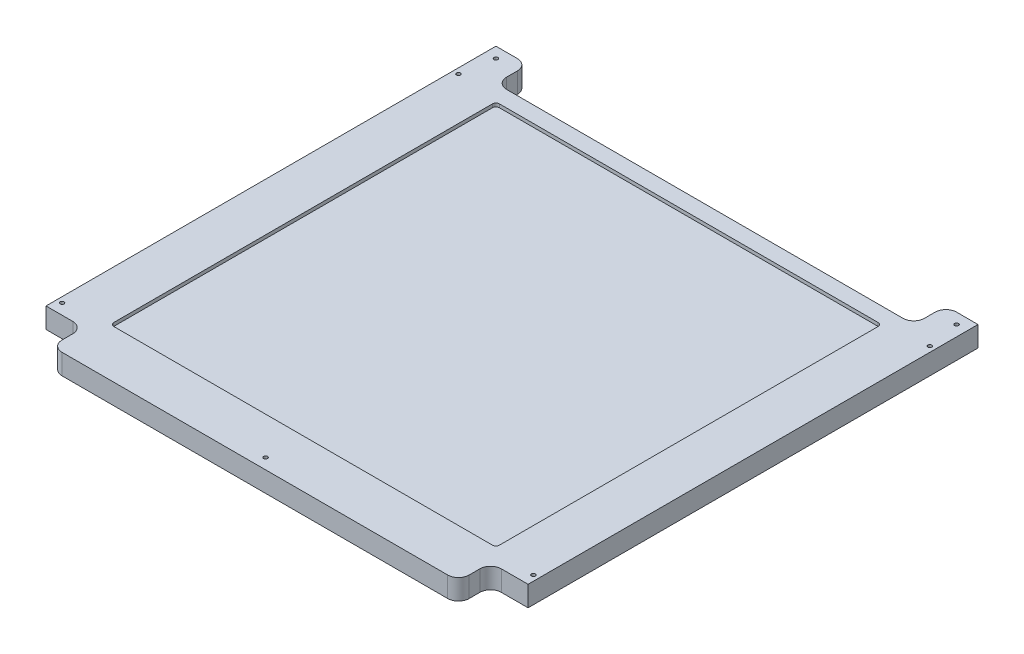
ISO-10303-21;
HEADER;
FILE_DESCRIPTION(('STEP AP214'),'2;1');
FILE_NAME('part.step','',(''),(''),'','','');
FILE_SCHEMA(('AUTOMOTIVE_DESIGN { 1 0 10303 214 1 1 1 1 }'));
ENDSEC;
DATA;
#1=APPLICATION_CONTEXT('core data for automotive mechanical design processes');
#2=APPLICATION_PROTOCOL_DEFINITION('international standard','automotive_design',2000,#1);
#3=PRODUCT_CONTEXT('',#1,'mechanical');
#4=PRODUCT('Part','Part','',(#3));
#5=PRODUCT_RELATED_PRODUCT_CATEGORY('part','',(#4));
#6=PRODUCT_DEFINITION_FORMATION('','',#4);
#7=PRODUCT_DEFINITION_CONTEXT('part definition',#1,'design');
#8=PRODUCT_DEFINITION('design','',#6,#7);
#9=PRODUCT_DEFINITION_SHAPE('','',#8);
#10=(LENGTH_UNIT() NAMED_UNIT(*) SI_UNIT(.MILLI.,.METRE.));
#11=(NAMED_UNIT(*) PLANE_ANGLE_UNIT() SI_UNIT($,.RADIAN.));
#12=(NAMED_UNIT(*) SI_UNIT($,.STERADIAN.) SOLID_ANGLE_UNIT());
#13=UNCERTAINTY_MEASURE_WITH_UNIT(LENGTH_MEASURE(1.E-05),#10,'distance_accuracy_value','');
#14=(GEOMETRIC_REPRESENTATION_CONTEXT(3) GLOBAL_UNCERTAINTY_ASSIGNED_CONTEXT((#13)) GLOBAL_UNIT_ASSIGNED_CONTEXT((#10,
#11,#12)) REPRESENTATION_CONTEXT('',''));
#15=CARTESIAN_POINT('',(0.,0.,0.));
#16=DIRECTION('',(0.,0.,1.));
#17=DIRECTION('',(1.,0.,0.));
#18=AXIS2_PLACEMENT_3D('',#15,#16,#17);
#19=CARTESIAN_POINT('',(0.,19.05,0.));
#20=DIRECTION('',(0.,-1.,0.));
#21=DIRECTION('',(0.,0.,-1.));
#22=AXIS2_PLACEMENT_3D('',#19,#20,#21);
#23=PLANE('',#22);
#24=CARTESIAN_POINT('',(445.,19.05,-410.));
#25=DIRECTION('',(0.,1.,0.));
#26=DIRECTION('',(0.,0.,1.));
#27=AXIS2_PLACEMENT_3D('',#24,#25,#26);
#28=CIRCLE('',#27,1.79999999999997);
#29=CARTESIAN_POINT('',(445.,19.05,-408.2));
#30=VERTEX_POINT('',#29);
#31=EDGE_CURVE('E862',#30,#30,#28,.T.);
#32=ORIENTED_EDGE('',*,*,#31,.F.);
#33=EDGE_LOOP('',(#32));
#34=FACE_BOUND('',#33,.T.);
#35=CARTESIAN_POINT('',(5.,19.05,-410.));
#36=DIRECTION('',(0.,1.,0.));
#37=DIRECTION('',(0.,0.,1.));
#38=AXIS2_PLACEMENT_3D('',#35,#36,#37);
#39=CIRCLE('',#38,1.79999999999999);
#40=CARTESIAN_POINT('',(5.,19.05,-408.2));
#41=VERTEX_POINT('',#40);
#42=EDGE_CURVE('E864',#41,#41,#39,.T.);
#43=ORIENTED_EDGE('',*,*,#42,.F.);
#44=EDGE_LOOP('',(#43));
#45=FACE_BOUND('',#44,.T.);
#46=CARTESIAN_POINT('',(5.,19.05,-40.));
#47=DIRECTION('',(0.,1.,0.));
#48=DIRECTION('',(0.,0.,1.));
#49=AXIS2_PLACEMENT_3D('',#46,#47,#48);
#50=CIRCLE('',#49,1.79999999999999);
#51=CARTESIAN_POINT('',(5.,19.05,-38.2));
#52=VERTEX_POINT('',#51);
#53=EDGE_CURVE('E872',#52,#52,#50,.T.);
#54=ORIENTED_EDGE('',*,*,#53,.F.);
#55=EDGE_LOOP('',(#54));
#56=FACE_BOUND('',#55,.T.);
#57=CARTESIAN_POINT('',(225.,19.05,-10.));
#58=DIRECTION('',(0.,1.,0.));
#59=DIRECTION('',(0.,0.,1.));
#60=AXIS2_PLACEMENT_3D('',#57,#58,#59);
#61=CIRCLE('',#60,1.8);
#62=CARTESIAN_POINT('',(225.,19.05,-8.2));
#63=VERTEX_POINT('',#62);
#64=EDGE_CURVE('E895',#63,#63,#61,.T.);
#65=ORIENTED_EDGE('',*,*,#64,.F.);
#66=EDGE_LOOP('',(#65));
#67=FACE_BOUND('',#66,.T.);
#68=DIRECTION('',(0.,0.,1.));
#69=VECTOR('',#68,1.);
#70=CARTESIAN_POINT('',(45.,19.05,-45.));
#71=LINE('',#70,#69);
#72=CARTESIAN_POINT('',(45.,19.05,-401.825));
#73=VERTEX_POINT('',#72);
#74=CARTESIAN_POINT('',(45.,19.05,-48.175));
#75=VERTEX_POINT('',#74);
#76=EDGE_CURVE('E401',#73,#75,#71,.T.);
#77=ORIENTED_EDGE('',*,*,#76,.F.);
#78=CARTESIAN_POINT('',(48.175,19.05,-401.825));
#79=DIRECTION('',(0.,-1.,0.));
#80=DIRECTION('',(0.,0.,-1.));
#81=AXIS2_PLACEMENT_3D('',#78,#79,#80);
#82=CIRCLE('',#81,3.175);
#83=CARTESIAN_POINT('',(48.175,19.05,-405.));
#84=VERTEX_POINT('',#83);
#85=EDGE_CURVE('E11',#73,#84,#82,.T.);
#86=ORIENTED_EDGE('',*,*,#85,.T.);
#87=DIRECTION('',(-1.,0.,0.));
#88=VECTOR('',#87,1.);
#89=CARTESIAN_POINT('',(45.,19.05,-405.));
#90=LINE('',#89,#88);
#91=CARTESIAN_POINT('',(401.825,19.05,-405.));
#92=VERTEX_POINT('',#91);
#93=EDGE_CURVE('E367',#92,#84,#90,.T.);
#94=ORIENTED_EDGE('',*,*,#93,.F.);
#95=CARTESIAN_POINT('',(401.825,19.05,-401.825));
#96=DIRECTION('',(0.,-1.,0.));
#97=DIRECTION('',(0.,0.,-1.));
#98=AXIS2_PLACEMENT_3D('',#95,#96,#97);
#99=CIRCLE('',#98,3.175);
#100=CARTESIAN_POINT('',(405.,19.05,-401.825));
#101=VERTEX_POINT('',#100);
#102=EDGE_CURVE('E43',#92,#101,#99,.T.);
#103=ORIENTED_EDGE('',*,*,#102,.T.);
#104=DIRECTION('',(0.,0.,-1.));
#105=VECTOR('',#104,1.);
#106=CARTESIAN_POINT('',(405.,19.05,-45.));
#107=LINE('',#106,#105);
#108=CARTESIAN_POINT('',(405.,19.05,-48.175));
#109=VERTEX_POINT('',#108);
#110=EDGE_CURVE('E366',#109,#101,#107,.T.);
#111=ORIENTED_EDGE('',*,*,#110,.F.);
#112=CARTESIAN_POINT('',(401.825,19.05,-48.175));
#113=DIRECTION('',(0.,-1.,0.));
#114=DIRECTION('',(0.,0.,-1.));
#115=AXIS2_PLACEMENT_3D('',#112,#113,#114);
#116=CIRCLE('',#115,3.175);
#117=CARTESIAN_POINT('',(401.825,19.05,-45.));
#118=VERTEX_POINT('',#117);
#119=EDGE_CURVE('E362',#109,#118,#116,.T.);
#120=ORIENTED_EDGE('',*,*,#119,.T.);
#121=DIRECTION('',(1.,0.,0.));
#122=VECTOR('',#121,1.);
#123=CARTESIAN_POINT('',(45.,19.05,-45.));
#124=LINE('',#123,#122);
#125=CARTESIAN_POINT('',(48.175,19.05,-45.));
#126=VERTEX_POINT('',#125);
#127=EDGE_CURVE('E374',#126,#118,#124,.T.);
#128=ORIENTED_EDGE('',*,*,#127,.F.);
#129=CARTESIAN_POINT('',(48.175,19.05,-48.175));
#130=DIRECTION('',(0.,-1.,0.));
#131=DIRECTION('',(0.,0.,-1.));
#132=AXIS2_PLACEMENT_3D('',#129,#130,#131);
#133=CIRCLE('',#132,3.175);
#134=EDGE_CURVE('E360',#126,#75,#133,.T.);
#135=ORIENTED_EDGE('',*,*,#134,.T.);
#136=EDGE_LOOP('',(#77,#86,#94,#103,#111,#120,#128,#135));
#137=FACE_BOUND('',#136,.T.);
#138=DIRECTION('',(-1.,0.,0.));
#139=VECTOR('',#138,1.);
#140=CARTESIAN_POINT('',(0.,19.05,-450.));
#141=LINE('',#140,#139);
#142=CARTESIAN_POINT('',(450.,19.05,-450.));
#143=VERTEX_POINT('',#142);
#144=CARTESIAN_POINT('',(430.,19.05,-450.));
#145=VERTEX_POINT('',#144);
#146=EDGE_CURVE('E260',#143,#145,#141,.T.);
#147=ORIENTED_EDGE('',*,*,#146,.T.);
#148=CARTESIAN_POINT('',(430.,19.05,-440.));
#149=DIRECTION('',(0.,-1.,0.));
#150=DIRECTION('',(0.,0.,-1.));
#151=AXIS2_PLACEMENT_3D('',#148,#149,#150);
#152=CIRCLE('',#151,10.);
#153=CARTESIAN_POINT('',(420.,19.05,-440.));
#154=VERTEX_POINT('',#153);
#155=EDGE_CURVE('E271',#145,#154,#152,.F.);
#156=ORIENTED_EDGE('',*,*,#155,.T.);
#157=DIRECTION('',(0.,0.,-1.));
#158=VECTOR('',#157,1.);
#159=CARTESIAN_POINT('',(420.,19.05,-450.));
#160=LINE('',#159,#158);
#161=CARTESIAN_POINT('',(420.,19.05,-430.));
#162=VERTEX_POINT('',#161);
#163=EDGE_CURVE('E415',#162,#154,#160,.T.);
#164=ORIENTED_EDGE('',*,*,#163,.F.);
#165=CARTESIAN_POINT('',(410.,19.05,-430.));
#166=DIRECTION('',(0.,-1.,0.));
#167=DIRECTION('',(0.,0.,-1.));
#168=AXIS2_PLACEMENT_3D('',#165,#166,#167);
#169=CIRCLE('',#168,10.);
#170=CARTESIAN_POINT('',(410.,19.05,-420.));
#171=VERTEX_POINT('',#170);
#172=EDGE_CURVE('E317',#162,#171,#169,.T.);
#173=ORIENTED_EDGE('',*,*,#172,.T.);
#174=DIRECTION('',(1.,0.,0.));
#175=VECTOR('',#174,1.);
#176=CARTESIAN_POINT('',(30.,19.05,-420.));
#177=LINE('',#176,#175);
#178=CARTESIAN_POINT('',(40.,19.05,-420.));
#179=VERTEX_POINT('',#178);
#180=EDGE_CURVE('E423',#179,#171,#177,.T.);
#181=ORIENTED_EDGE('',*,*,#180,.F.);
#182=CARTESIAN_POINT('',(40.,19.05,-430.));
#183=DIRECTION('',(0.,-1.,0.));
#184=DIRECTION('',(0.,0.,-1.));
#185=AXIS2_PLACEMENT_3D('',#182,#183,#184);
#186=CIRCLE('',#185,10.);
#187=CARTESIAN_POINT('',(30.,19.05,-430.));
#188=VERTEX_POINT('',#187);
#189=EDGE_CURVE('E321',#179,#188,#186,.T.);
#190=ORIENTED_EDGE('',*,*,#189,.T.);
#191=DIRECTION('',(0.,0.,1.));
#192=VECTOR('',#191,1.);
#193=CARTESIAN_POINT('',(30.,19.05,-450.));
#194=LINE('',#193,#192);
#195=CARTESIAN_POINT('',(30.,19.05,-440.));
#196=VERTEX_POINT('',#195);
#197=EDGE_CURVE('E239',#196,#188,#194,.T.);
#198=ORIENTED_EDGE('',*,*,#197,.F.);
#199=CARTESIAN_POINT('',(20.,19.05,-440.));
#200=DIRECTION('',(0.,-1.,0.));
#201=DIRECTION('',(0.,0.,-1.));
#202=AXIS2_PLACEMENT_3D('',#199,#200,#201);
#203=CIRCLE('',#202,10.);
#204=CARTESIAN_POINT('',(20.,19.05,-450.));
#205=VERTEX_POINT('',#204);
#206=EDGE_CURVE('E269',#196,#205,#203,.F.);
#207=ORIENTED_EDGE('',*,*,#206,.T.);
#208=CARTESIAN_POINT('',(0.,19.05,-450.));
#209=VERTEX_POINT('',#208);
#210=EDGE_CURVE('E446',#205,#209,#141,.T.);
#211=ORIENTED_EDGE('',*,*,#210,.T.);
#212=DIRECTION('',(0.,0.,1.));
#213=VECTOR('',#212,1.);
#214=CARTESIAN_POINT('',(0.,19.05,0.));
#215=LINE('',#214,#213);
#216=CARTESIAN_POINT('',(0.,19.05,-30.));
#217=VERTEX_POINT('',#216);
#218=EDGE_CURVE('E255',#209,#217,#215,.T.);
#219=ORIENTED_EDGE('',*,*,#218,.T.);
#220=DIRECTION('',(-1.,0.,0.));
#221=VECTOR('',#220,1.);
#222=CARTESIAN_POINT('',(0.,19.05,-30.));
#223=LINE('',#222,#221);
#224=CARTESIAN_POINT('',(25.,19.05,-30.));
#225=VERTEX_POINT('',#224);
#226=EDGE_CURVE('E432',#225,#217,#223,.T.);
#227=ORIENTED_EDGE('',*,*,#226,.F.);
#228=CARTESIAN_POINT('',(25.,19.05,-20.));
#229=DIRECTION('',(0.,-1.,0.));
#230=DIRECTION('',(0.,0.,-1.));
#231=AXIS2_PLACEMENT_3D('',#228,#229,#230);
#232=CIRCLE('',#231,10.);
#233=CARTESIAN_POINT('',(35.,19.05,-20.));
#234=VERTEX_POINT('',#233);
#235=EDGE_CURVE('E329',#225,#234,#232,.T.);
#236=ORIENTED_EDGE('',*,*,#235,.T.);
#237=DIRECTION('',(0.,0.,-1.));
#238=VECTOR('',#237,1.);
#239=CARTESIAN_POINT('',(35.,19.05,0.));
#240=LINE('',#239,#238);
#241=CARTESIAN_POINT('',(35.,19.05,-10.));
#242=VERTEX_POINT('',#241);
#243=EDGE_CURVE('E420',#242,#234,#240,.T.);
#244=ORIENTED_EDGE('',*,*,#243,.F.);
#245=CARTESIAN_POINT('',(45.,19.05,-10.));
#246=DIRECTION('',(0.,-1.,0.));
#247=DIRECTION('',(0.,0.,-1.));
#248=AXIS2_PLACEMENT_3D('',#245,#246,#247);
#249=CIRCLE('',#248,10.);
#250=CARTESIAN_POINT('',(45.,19.05,0.));
#251=VERTEX_POINT('',#250);
#252=EDGE_CURVE('E265',#242,#251,#249,.F.);
#253=ORIENTED_EDGE('',*,*,#252,.T.);
#254=DIRECTION('',(1.,0.,0.));
#255=VECTOR('',#254,1.);
#256=CARTESIAN_POINT('',(0.,19.05,0.));
#257=LINE('',#256,#255);
#258=CARTESIAN_POINT('',(405.,19.05,0.));
#259=VERTEX_POINT('',#258);
#260=EDGE_CURVE('E442',#251,#259,#257,.T.);
#261=ORIENTED_EDGE('',*,*,#260,.T.);
#262=CARTESIAN_POINT('',(405.,19.05,-10.));
#263=DIRECTION('',(0.,-1.,0.));
#264=DIRECTION('',(0.,0.,-1.));
#265=AXIS2_PLACEMENT_3D('',#262,#263,#264);
#266=CIRCLE('',#265,10.);
#267=CARTESIAN_POINT('',(415.,19.05,-10.));
#268=VERTEX_POINT('',#267);
#269=EDGE_CURVE('E267',#259,#268,#266,.F.);
#270=ORIENTED_EDGE('',*,*,#269,.T.);
#271=DIRECTION('',(0.,0.,1.));
#272=VECTOR('',#271,1.);
#273=CARTESIAN_POINT('',(415.,19.05,0.));
#274=LINE('',#273,#272);
#275=CARTESIAN_POINT('',(415.,19.05,-20.));
#276=VERTEX_POINT('',#275);
#277=EDGE_CURVE('E230',#276,#268,#274,.T.);
#278=ORIENTED_EDGE('',*,*,#277,.F.);
#279=CARTESIAN_POINT('',(425.,19.05,-20.));
#280=DIRECTION('',(0.,-1.,0.));
#281=DIRECTION('',(0.,0.,-1.));
#282=AXIS2_PLACEMENT_3D('',#279,#280,#281);
#283=CIRCLE('',#282,10.);
#284=CARTESIAN_POINT('',(425.,19.05,-30.));
#285=VERTEX_POINT('',#284);
#286=EDGE_CURVE('E325',#276,#285,#283,.T.);
#287=ORIENTED_EDGE('',*,*,#286,.T.);
#288=DIRECTION('',(-1.,0.,0.));
#289=VECTOR('',#288,1.);
#290=CARTESIAN_POINT('',(450.,19.05,-30.));
#291=LINE('',#290,#289);
#292=CARTESIAN_POINT('',(450.,19.05,-30.));
#293=VERTEX_POINT('',#292);
#294=EDGE_CURVE('E399',#293,#285,#291,.T.);
#295=ORIENTED_EDGE('',*,*,#294,.F.);
#296=DIRECTION('',(0.,0.,-1.));
#297=VECTOR('',#296,1.);
#298=CARTESIAN_POINT('',(450.,19.05,0.));
#299=LINE('',#298,#297);
#300=EDGE_CURVE('E238',#293,#143,#299,.T.);
#301=ORIENTED_EDGE('',*,*,#300,.T.);
#302=EDGE_LOOP('',(#147,#156,#164,#173,#181,#190,#198,#207,#211,#219,#227,#236,#244,#253,#261,
#270,#278,#287,#295,#301));
#303=FACE_BOUND('',#302,.T.);
#304=CARTESIAN_POINT('',(10.,19.05,-440.));
#305=DIRECTION('',(0.,1.,0.));
#306=DIRECTION('',(0.,0.,1.));
#307=AXIS2_PLACEMENT_3D('',#304,#305,#306);
#308=CIRCLE('',#307,1.79999999999999);
#309=CARTESIAN_POINT('',(10.,19.05,-438.2));
#310=VERTEX_POINT('',#309);
#311=EDGE_CURVE('E890',#310,#310,#308,.T.);
#312=ORIENTED_EDGE('',*,*,#311,.F.);
#313=EDGE_LOOP('',(#312));
#314=FACE_BOUND('',#313,.T.);
#315=CARTESIAN_POINT('',(440.,19.05,-440.));
#316=DIRECTION('',(0.,1.,0.));
#317=DIRECTION('',(0.,0.,1.));
#318=AXIS2_PLACEMENT_3D('',#315,#316,#317);
#319=CIRCLE('',#318,1.79999999999997);
#320=CARTESIAN_POINT('',(440.,19.05,-438.2));
#321=VERTEX_POINT('',#320);
#322=EDGE_CURVE('E884',#321,#321,#319,.T.);
#323=ORIENTED_EDGE('',*,*,#322,.F.);
#324=EDGE_LOOP('',(#323));
#325=FACE_BOUND('',#324,.T.);
#326=CARTESIAN_POINT('',(445.,19.05,-40.));
#327=DIRECTION('',(0.,1.,0.));
#328=DIRECTION('',(0.,0.,1.));
#329=AXIS2_PLACEMENT_3D('',#326,#327,#328);
#330=CIRCLE('',#329,1.79999999999997);
#331=CARTESIAN_POINT('',(445.,19.05,-38.2));
#332=VERTEX_POINT('',#331);
#333=EDGE_CURVE('E878',#332,#332,#330,.T.);
#334=ORIENTED_EDGE('',*,*,#333,.F.);
#335=EDGE_LOOP('',(#334));
#336=FACE_BOUND('',#335,.T.);
#337=ADVANCED_FACE('F35',(#34,#45,#56,#67,#137,#303,#314,#325,#336),#23,.F.);
#338=CARTESIAN_POINT('',(0.,19.05,-450.));
#339=DIRECTION('',(0.,0.,1.));
#340=DIRECTION('',(1.,0.,0.));
#341=AXIS2_PLACEMENT_3D('',#338,#339,#340);
#342=PLANE('',#341);
#343=ORIENTED_EDGE('',*,*,#210,.F.);
#344=DIRECTION('',(0.,1.,0.));
#345=VECTOR('',#344,1.);
#346=CARTESIAN_POINT('',(20.,19.05,-450.));
#347=LINE('',#346,#345);
#348=CARTESIAN_POINT('',(20.,0.,-450.));
#349=VERTEX_POINT('',#348);
#350=EDGE_CURVE('E296',#205,#349,#347,.F.);
#351=ORIENTED_EDGE('',*,*,#350,.T.);
#352=DIRECTION('',(-1.,0.,0.));
#353=VECTOR('',#352,1.);
#354=CARTESIAN_POINT('',(0.,0.,-450.));
#355=LINE('',#354,#353);
#356=CARTESIAN_POINT('',(0.,0.,-450.));
#357=VERTEX_POINT('',#356);
#358=EDGE_CURVE('E246',#349,#357,#355,.T.);
#359=ORIENTED_EDGE('',*,*,#358,.T.);
#360=DIRECTION('',(0.,-1.,0.));
#361=VECTOR('',#360,1.);
#362=CARTESIAN_POINT('',(0.,19.05,-450.));
#363=LINE('',#362,#361);
#364=EDGE_CURVE('E256',#209,#357,#363,.T.);
#365=ORIENTED_EDGE('',*,*,#364,.F.);
#366=EDGE_LOOP('',(#343,#351,#359,#365));
#367=FACE_BOUND('',#366,.T.);
#368=ADVANCED_FACE('F469',(#367),#342,.F.);
#369=CARTESIAN_POINT('',(0.,19.05,0.));
#370=DIRECTION('',(1.,0.,0.));
#371=DIRECTION('',(0.,0.,-1.));
#372=AXIS2_PLACEMENT_3D('',#369,#370,#371);
#373=PLANE('',#372);
#374=DIRECTION('',(0.,0.,1.));
#375=VECTOR('',#374,1.);
#376=CARTESIAN_POINT('',(0.,0.,0.));
#377=LINE('',#376,#375);
#378=CARTESIAN_POINT('',(0.,0.,-30.));
#379=VERTEX_POINT('',#378);
#380=EDGE_CURVE('E251',#357,#379,#377,.T.);
#381=ORIENTED_EDGE('',*,*,#380,.T.);
#382=DIRECTION('',(0.,1.,0.));
#383=VECTOR('',#382,1.);
#384=CARTESIAN_POINT('',(0.,0.,-30.));
#385=LINE('',#384,#383);
#386=EDGE_CURVE('E434',#379,#217,#385,.T.);
#387=ORIENTED_EDGE('',*,*,#386,.T.);
#388=ORIENTED_EDGE('',*,*,#218,.F.);
#389=ORIENTED_EDGE('',*,*,#364,.T.);
#390=EDGE_LOOP('',(#381,#387,#388,#389));
#391=FACE_BOUND('',#390,.T.);
#392=ADVANCED_FACE('F451',(#391),#373,.F.);
#393=CARTESIAN_POINT('',(0.,19.05,0.));
#394=DIRECTION('',(0.,0.,-1.));
#395=DIRECTION('',(-1.,0.,0.));
#396=AXIS2_PLACEMENT_3D('',#393,#394,#395);
#397=PLANE('',#396);
#398=DIRECTION('',(1.,0.,0.));
#399=VECTOR('',#398,1.);
#400=CARTESIAN_POINT('',(0.,0.,0.));
#401=LINE('',#400,#399);
#402=CARTESIAN_POINT('',(45.,0.,0.));
#403=VERTEX_POINT('',#402);
#404=CARTESIAN_POINT('',(405.,0.,0.));
#405=VERTEX_POINT('',#404);
#406=EDGE_CURVE('E247',#403,#405,#401,.T.);
#407=ORIENTED_EDGE('',*,*,#406,.T.);
#408=DIRECTION('',(0.,1.,0.));
#409=VECTOR('',#408,1.);
#410=CARTESIAN_POINT('',(405.,19.05,0.));
#411=LINE('',#410,#409);
#412=EDGE_CURVE('E306',#405,#259,#411,.T.);
#413=ORIENTED_EDGE('',*,*,#412,.T.);
#414=ORIENTED_EDGE('',*,*,#260,.F.);
#415=DIRECTION('',(0.,1.,0.));
#416=VECTOR('',#415,1.);
#417=CARTESIAN_POINT('',(45.,19.05,0.));
#418=LINE('',#417,#416);
#419=EDGE_CURVE('E304',#251,#403,#418,.F.);
#420=ORIENTED_EDGE('',*,*,#419,.T.);
#421=EDGE_LOOP('',(#407,#413,#414,#420));
#422=FACE_BOUND('',#421,.T.);
#423=ADVANCED_FACE('F517',(#422),#397,.F.);
#424=CARTESIAN_POINT('',(450.,19.05,0.));
#425=DIRECTION('',(-1.,0.,0.));
#426=DIRECTION('',(0.,0.,1.));
#427=AXIS2_PLACEMENT_3D('',#424,#425,#426);
#428=PLANE('',#427);
#429=ORIENTED_EDGE('',*,*,#300,.F.);
#430=DIRECTION('',(0.,1.,0.));
#431=VECTOR('',#430,1.);
#432=CARTESIAN_POINT('',(450.,0.,-30.));
#433=LINE('',#432,#431);
#434=CARTESIAN_POINT('',(450.,0.,-30.));
#435=VERTEX_POINT('',#434);
#436=EDGE_CURVE('E222',#435,#293,#433,.T.);
#437=ORIENTED_EDGE('',*,*,#436,.F.);
#438=DIRECTION('',(0.,0.,-1.));
#439=VECTOR('',#438,1.);
#440=CARTESIAN_POINT('',(450.,0.,0.));
#441=LINE('',#440,#439);
#442=CARTESIAN_POINT('',(450.,0.,-450.));
#443=VERTEX_POINT('',#442);
#444=EDGE_CURVE('E236',#435,#443,#441,.T.);
#445=ORIENTED_EDGE('',*,*,#444,.T.);
#446=DIRECTION('',(0.,-1.,0.));
#447=VECTOR('',#446,1.);
#448=CARTESIAN_POINT('',(450.,19.05,-450.));
#449=LINE('',#448,#447);
#450=EDGE_CURVE('E259',#143,#443,#449,.T.);
#451=ORIENTED_EDGE('',*,*,#450,.F.);
#452=EDGE_LOOP('',(#429,#437,#445,#451));
#453=FACE_BOUND('',#452,.T.);
#454=ADVANCED_FACE('F234',(#453),#428,.F.);
#455=CARTESIAN_POINT('',(430.,0.,-450.));
#456=VERTEX_POINT('',#455);
#457=EDGE_CURVE('E245',#443,#456,#355,.T.);
#458=ORIENTED_EDGE('',*,*,#457,.T.);
#459=DIRECTION('',(0.,1.,0.));
#460=VECTOR('',#459,1.);
#461=CARTESIAN_POINT('',(430.,19.05,-450.));
#462=LINE('',#461,#460);
#463=EDGE_CURVE('E262',#456,#145,#462,.T.);
#464=ORIENTED_EDGE('',*,*,#463,.T.);
#465=ORIENTED_EDGE('',*,*,#146,.F.);
#466=ORIENTED_EDGE('',*,*,#450,.T.);
#467=EDGE_LOOP('',(#458,#464,#465,#466));
#468=FACE_BOUND('',#467,.T.);
#469=ADVANCED_FACE('F500',(#468),#342,.F.);
#470=CARTESIAN_POINT('',(0.,0.,0.));
#471=DIRECTION('',(0.,-1.,0.));
#472=DIRECTION('',(0.,0.,-1.));
#473=AXIS2_PLACEMENT_3D('',#470,#471,#472);
#474=PLANE('',#473);
#475=CARTESIAN_POINT('',(445.,0.,-410.));
#476=DIRECTION('',(0.,1.,0.));
#477=DIRECTION('',(0.,0.,1.));
#478=AXIS2_PLACEMENT_3D('',#475,#476,#477);
#479=CIRCLE('',#478,1.80000000000002);
#480=CARTESIAN_POINT('',(445.,0.,-408.2));
#481=VERTEX_POINT('',#480);
#482=EDGE_CURVE('E860',#481,#481,#479,.T.);
#483=ORIENTED_EDGE('',*,*,#482,.T.);
#484=EDGE_LOOP('',(#483));
#485=FACE_BOUND('',#484,.T.);
#486=CARTESIAN_POINT('',(5.,0.,-410.));
#487=DIRECTION('',(0.,1.,0.));
#488=DIRECTION('',(0.,0.,1.));
#489=AXIS2_PLACEMENT_3D('',#486,#487,#488);
#490=CIRCLE('',#489,1.8);
#491=CARTESIAN_POINT('',(5.,0.,-408.2));
#492=VERTEX_POINT('',#491);
#493=EDGE_CURVE('E869',#492,#492,#490,.T.);
#494=ORIENTED_EDGE('',*,*,#493,.T.);
#495=EDGE_LOOP('',(#494));
#496=FACE_BOUND('',#495,.T.);
#497=CARTESIAN_POINT('',(5.,0.,-40.));
#498=DIRECTION('',(0.,1.,0.));
#499=DIRECTION('',(0.,0.,1.));
#500=AXIS2_PLACEMENT_3D('',#497,#498,#499);
#501=CIRCLE('',#500,1.8);
#502=CARTESIAN_POINT('',(5.,0.,-38.2));
#503=VERTEX_POINT('',#502);
#504=EDGE_CURVE('E875',#503,#503,#501,.T.);
#505=ORIENTED_EDGE('',*,*,#504,.T.);
#506=EDGE_LOOP('',(#505));
#507=FACE_BOUND('',#506,.T.);
#508=CARTESIAN_POINT('',(445.,0.,-40.));
#509=DIRECTION('',(0.,1.,0.));
#510=DIRECTION('',(0.,0.,1.));
#511=AXIS2_PLACEMENT_3D('',#508,#509,#510);
#512=CIRCLE('',#511,1.80000000000002);
#513=CARTESIAN_POINT('',(445.,0.,-38.2));
#514=VERTEX_POINT('',#513);
#515=EDGE_CURVE('E881',#514,#514,#512,.T.);
#516=ORIENTED_EDGE('',*,*,#515,.T.);
#517=EDGE_LOOP('',(#516));
#518=FACE_BOUND('',#517,.T.);
#519=CARTESIAN_POINT('',(440.,0.,-440.));
#520=DIRECTION('',(0.,1.,0.));
#521=DIRECTION('',(0.,0.,1.));
#522=AXIS2_PLACEMENT_3D('',#519,#520,#521);
#523=CIRCLE('',#522,1.80000000000002);
#524=CARTESIAN_POINT('',(440.,0.,-438.2));
#525=VERTEX_POINT('',#524);
#526=EDGE_CURVE('E887',#525,#525,#523,.T.);
#527=ORIENTED_EDGE('',*,*,#526,.T.);
#528=EDGE_LOOP('',(#527));
#529=FACE_BOUND('',#528,.T.);
#530=CARTESIAN_POINT('',(10.,0.,-440.));
#531=DIRECTION('',(0.,1.,0.));
#532=DIRECTION('',(0.,0.,1.));
#533=AXIS2_PLACEMENT_3D('',#530,#531,#532);
#534=CIRCLE('',#533,1.8);
#535=CARTESIAN_POINT('',(10.,0.,-438.2));
#536=VERTEX_POINT('',#535);
#537=EDGE_CURVE('E893',#536,#536,#534,.T.);
#538=ORIENTED_EDGE('',*,*,#537,.T.);
#539=EDGE_LOOP('',(#538));
#540=FACE_BOUND('',#539,.T.);
#541=CARTESIAN_POINT('',(225.,0.,-10.));
#542=DIRECTION('',(0.,1.,0.));
#543=DIRECTION('',(0.,0.,1.));
#544=AXIS2_PLACEMENT_3D('',#541,#542,#543);
#545=CIRCLE('',#544,1.8);
#546=CARTESIAN_POINT('',(225.,0.,-8.2));
#547=VERTEX_POINT('',#546);
#548=EDGE_CURVE('E393',#547,#547,#545,.T.);
#549=ORIENTED_EDGE('',*,*,#548,.T.);
#550=EDGE_LOOP('',(#549));
#551=FACE_BOUND('',#550,.T.);
#552=DIRECTION('',(0.,0.,-1.));
#553=VECTOR('',#552,1.);
#554=CARTESIAN_POINT('',(420.,0.,-450.));
#555=LINE('',#554,#553);
#556=CARTESIAN_POINT('',(420.,0.,-430.));
#557=VERTEX_POINT('',#556);
#558=CARTESIAN_POINT('',(420.,0.,-440.));
#559=VERTEX_POINT('',#558);
#560=EDGE_CURVE('E418',#557,#559,#555,.T.);
#561=ORIENTED_EDGE('',*,*,#560,.T.);
#562=CARTESIAN_POINT('',(430.,0.,-440.));
#563=DIRECTION('',(0.,-1.,0.));
#564=DIRECTION('',(0.,0.,-1.));
#565=AXIS2_PLACEMENT_3D('',#562,#563,#564);
#566=CIRCLE('',#565,10.);
#567=EDGE_CURVE('E284',#559,#456,#566,.T.);
#568=ORIENTED_EDGE('',*,*,#567,.T.);
#569=ORIENTED_EDGE('',*,*,#457,.F.);
#570=ORIENTED_EDGE('',*,*,#444,.F.);
#571=DIRECTION('',(-1.,0.,0.));
#572=VECTOR('',#571,1.);
#573=CARTESIAN_POINT('',(450.,0.,-30.));
#574=LINE('',#573,#572);
#575=CARTESIAN_POINT('',(425.,0.,-30.));
#576=VERTEX_POINT('',#575);
#577=EDGE_CURVE('E218',#435,#576,#574,.T.);
#578=ORIENTED_EDGE('',*,*,#577,.T.);
#579=CARTESIAN_POINT('',(425.,0.,-20.));
#580=DIRECTION('',(0.,-1.,0.));
#581=DIRECTION('',(0.,0.,-1.));
#582=AXIS2_PLACEMENT_3D('',#579,#580,#581);
#583=CIRCLE('',#582,10.);
#584=CARTESIAN_POINT('',(415.,0.,-20.));
#585=VERTEX_POINT('',#584);
#586=EDGE_CURVE('E327',#576,#585,#583,.F.);
#587=ORIENTED_EDGE('',*,*,#586,.T.);
#588=DIRECTION('',(0.,0.,1.));
#589=VECTOR('',#588,1.);
#590=CARTESIAN_POINT('',(415.,0.,0.));
#591=LINE('',#590,#589);
#592=CARTESIAN_POINT('',(415.,0.,-10.));
#593=VERTEX_POINT('',#592);
#594=EDGE_CURVE('E229',#585,#593,#591,.T.);
#595=ORIENTED_EDGE('',*,*,#594,.T.);
#596=CARTESIAN_POINT('',(405.,0.,-10.));
#597=DIRECTION('',(0.,-1.,0.));
#598=DIRECTION('',(0.,0.,-1.));
#599=AXIS2_PLACEMENT_3D('',#596,#597,#598);
#600=CIRCLE('',#599,10.);
#601=EDGE_CURVE('E280',#593,#405,#600,.T.);
#602=ORIENTED_EDGE('',*,*,#601,.T.);
#603=ORIENTED_EDGE('',*,*,#406,.F.);
#604=CARTESIAN_POINT('',(45.,0.,-10.));
#605=DIRECTION('',(0.,-1.,0.));
#606=DIRECTION('',(0.,0.,-1.));
#607=AXIS2_PLACEMENT_3D('',#604,#605,#606);
#608=CIRCLE('',#607,10.);
#609=CARTESIAN_POINT('',(35.,0.,-10.));
#610=VERTEX_POINT('',#609);
#611=EDGE_CURVE('E278',#403,#610,#608,.T.);
#612=ORIENTED_EDGE('',*,*,#611,.T.);
#613=DIRECTION('',(0.,0.,-1.));
#614=VECTOR('',#613,1.);
#615=CARTESIAN_POINT('',(35.,0.,0.));
#616=LINE('',#615,#614);
#617=CARTESIAN_POINT('',(35.,0.,-20.));
#618=VERTEX_POINT('',#617);
#619=EDGE_CURVE('E428',#610,#618,#616,.T.);
#620=ORIENTED_EDGE('',*,*,#619,.T.);
#621=CARTESIAN_POINT('',(25.,0.,-20.));
#622=DIRECTION('',(0.,-1.,0.));
#623=DIRECTION('',(0.,0.,-1.));
#624=AXIS2_PLACEMENT_3D('',#621,#622,#623);
#625=CIRCLE('',#624,10.);
#626=CARTESIAN_POINT('',(25.,0.,-30.));
#627=VERTEX_POINT('',#626);
#628=EDGE_CURVE('E331',#618,#627,#625,.F.);
#629=ORIENTED_EDGE('',*,*,#628,.T.);
#630=DIRECTION('',(-1.,0.,0.));
#631=VECTOR('',#630,1.);
#632=CARTESIAN_POINT('',(0.,0.,-30.));
#633=LINE('',#632,#631);
#634=EDGE_CURVE('E431',#627,#379,#633,.T.);
#635=ORIENTED_EDGE('',*,*,#634,.T.);
#636=ORIENTED_EDGE('',*,*,#380,.F.);
#637=ORIENTED_EDGE('',*,*,#358,.F.);
#638=CARTESIAN_POINT('',(20.,0.,-440.));
#639=DIRECTION('',(0.,-1.,0.));
#640=DIRECTION('',(0.,0.,-1.));
#641=AXIS2_PLACEMENT_3D('',#638,#639,#640);
#642=CIRCLE('',#641,10.);
#643=CARTESIAN_POINT('',(30.,0.,-440.));
#644=VERTEX_POINT('',#643);
#645=EDGE_CURVE('E282',#349,#644,#642,.T.);
#646=ORIENTED_EDGE('',*,*,#645,.T.);
#647=DIRECTION('',(0.,0.,1.));
#648=VECTOR('',#647,1.);
#649=CARTESIAN_POINT('',(30.,0.,-450.));
#650=LINE('',#649,#648);
#651=CARTESIAN_POINT('',(30.,0.,-430.));
#652=VERTEX_POINT('',#651);
#653=EDGE_CURVE('E411',#644,#652,#650,.T.);
#654=ORIENTED_EDGE('',*,*,#653,.T.);
#655=CARTESIAN_POINT('',(40.,0.,-430.));
#656=DIRECTION('',(0.,-1.,0.));
#657=DIRECTION('',(0.,0.,-1.));
#658=AXIS2_PLACEMENT_3D('',#655,#656,#657);
#659=CIRCLE('',#658,10.);
#660=CARTESIAN_POINT('',(40.,0.,-420.));
#661=VERTEX_POINT('',#660);
#662=EDGE_CURVE('E323',#652,#661,#659,.F.);
#663=ORIENTED_EDGE('',*,*,#662,.T.);
#664=DIRECTION('',(1.,0.,0.));
#665=VECTOR('',#664,1.);
#666=CARTESIAN_POINT('',(30.,0.,-420.));
#667=LINE('',#666,#665);
#668=CARTESIAN_POINT('',(410.,0.,-420.));
#669=VERTEX_POINT('',#668);
#670=EDGE_CURVE('E414',#661,#669,#667,.T.);
#671=ORIENTED_EDGE('',*,*,#670,.T.);
#672=CARTESIAN_POINT('',(410.,0.,-430.));
#673=DIRECTION('',(0.,-1.,0.));
#674=DIRECTION('',(0.,0.,-1.));
#675=AXIS2_PLACEMENT_3D('',#672,#673,#674);
#676=CIRCLE('',#675,10.);
#677=EDGE_CURVE('E319',#669,#557,#676,.F.);
#678=ORIENTED_EDGE('',*,*,#677,.T.);
#679=EDGE_LOOP('',(#561,#568,#569,#570,#578,#587,#595,#602,#603,#612,#620,#629,#635,#636,#637,
#646,#654,#663,#671,#678));
#680=FACE_BOUND('',#679,.T.);
#681=ADVANCED_FACE('F243',(#485,#496,#507,#518,#529,#540,#551,#680),#474,.T.);
#682=CARTESIAN_POINT('',(0.,0.,-30.));
#683=DIRECTION('',(0.,0.,-1.));
#684=DIRECTION('',(-1.,0.,0.));
#685=AXIS2_PLACEMENT_3D('',#682,#683,#684);
#686=PLANE('',#685);
#687=ORIENTED_EDGE('',*,*,#634,.F.);
#688=DIRECTION('',(0.,1.,0.));
#689=VECTOR('',#688,1.);
#690=CARTESIAN_POINT('',(25.,19.05,-30.));
#691=LINE('',#690,#689);
#692=EDGE_CURVE('E314',#627,#225,#691,.T.);
#693=ORIENTED_EDGE('',*,*,#692,.T.);
#694=ORIENTED_EDGE('',*,*,#226,.T.);
#695=ORIENTED_EDGE('',*,*,#386,.F.);
#696=EDGE_LOOP('',(#687,#693,#694,#695));
#697=FACE_BOUND('',#696,.T.);
#698=ADVANCED_FACE('F461',(#697),#686,.F.);
#699=CARTESIAN_POINT('',(35.,0.,0.));
#700=DIRECTION('',(1.,0.,0.));
#701=DIRECTION('',(0.,0.,-1.));
#702=AXIS2_PLACEMENT_3D('',#699,#700,#701);
#703=PLANE('',#702);
#704=ORIENTED_EDGE('',*,*,#619,.F.);
#705=DIRECTION('',(0.,1.,0.));
#706=VECTOR('',#705,1.);
#707=CARTESIAN_POINT('',(35.,0.,-10.));
#708=LINE('',#707,#706);
#709=EDGE_CURVE('E311',#610,#242,#708,.T.);
#710=ORIENTED_EDGE('',*,*,#709,.T.);
#711=ORIENTED_EDGE('',*,*,#243,.T.);
#712=DIRECTION('',(0.,1.,0.));
#713=VECTOR('',#712,1.);
#714=CARTESIAN_POINT('',(35.,0.,-20.));
#715=LINE('',#714,#713);
#716=EDGE_CURVE('E309',#234,#618,#715,.F.);
#717=ORIENTED_EDGE('',*,*,#716,.T.);
#718=EDGE_LOOP('',(#704,#710,#711,#717));
#719=FACE_BOUND('',#718,.T.);
#720=ADVANCED_FACE('F525',(#719),#703,.F.);
#721=CARTESIAN_POINT('',(30.,0.,-450.));
#722=DIRECTION('',(-1.,0.,0.));
#723=DIRECTION('',(0.,0.,1.));
#724=AXIS2_PLACEMENT_3D('',#721,#722,#723);
#725=PLANE('',#724);
#726=ORIENTED_EDGE('',*,*,#197,.T.);
#727=DIRECTION('',(0.,1.,0.));
#728=VECTOR('',#727,1.);
#729=CARTESIAN_POINT('',(30.,0.,-430.));
#730=LINE('',#729,#728);
#731=EDGE_CURVE('E294',#188,#652,#730,.F.);
#732=ORIENTED_EDGE('',*,*,#731,.T.);
#733=ORIENTED_EDGE('',*,*,#653,.F.);
#734=DIRECTION('',(0.,1.,0.));
#735=VECTOR('',#734,1.);
#736=CARTESIAN_POINT('',(30.,0.,-440.));
#737=LINE('',#736,#735);
#738=EDGE_CURVE('E291',#644,#196,#737,.T.);
#739=ORIENTED_EDGE('',*,*,#738,.T.);
#740=EDGE_LOOP('',(#726,#732,#733,#739));
#741=FACE_BOUND('',#740,.T.);
#742=ADVANCED_FACE('F476',(#741),#725,.F.);
#743=CARTESIAN_POINT('',(420.,0.,-450.));
#744=DIRECTION('',(1.,0.,0.));
#745=DIRECTION('',(0.,0.,-1.));
#746=AXIS2_PLACEMENT_3D('',#743,#744,#745);
#747=PLANE('',#746);
#748=ORIENTED_EDGE('',*,*,#163,.T.);
#749=DIRECTION('',(0.,1.,0.));
#750=VECTOR('',#749,1.);
#751=CARTESIAN_POINT('',(420.,0.,-440.));
#752=LINE('',#751,#750);
#753=EDGE_CURVE('E276',#154,#559,#752,.F.);
#754=ORIENTED_EDGE('',*,*,#753,.T.);
#755=ORIENTED_EDGE('',*,*,#560,.F.);
#756=DIRECTION('',(0.,1.,0.));
#757=VECTOR('',#756,1.);
#758=CARTESIAN_POINT('',(420.,19.05,-430.));
#759=LINE('',#758,#757);
#760=EDGE_CURVE('E273',#557,#162,#759,.T.);
#761=ORIENTED_EDGE('',*,*,#760,.T.);
#762=EDGE_LOOP('',(#748,#754,#755,#761));
#763=FACE_BOUND('',#762,.T.);
#764=ADVANCED_FACE('F493',(#763),#747,.F.);
#765=CARTESIAN_POINT('',(30.,0.,-420.));
#766=DIRECTION('',(0.,0.,1.));
#767=DIRECTION('',(1.,0.,0.));
#768=AXIS2_PLACEMENT_3D('',#765,#766,#767);
#769=PLANE('',#768);
#770=ORIENTED_EDGE('',*,*,#180,.T.);
#771=DIRECTION('',(0.,1.,0.));
#772=VECTOR('',#771,1.);
#773=CARTESIAN_POINT('',(410.,0.,-420.));
#774=LINE('',#773,#772);
#775=EDGE_CURVE('E289',#171,#669,#774,.F.);
#776=ORIENTED_EDGE('',*,*,#775,.T.);
#777=ORIENTED_EDGE('',*,*,#670,.F.);
#778=DIRECTION('',(0.,1.,0.));
#779=VECTOR('',#778,1.);
#780=CARTESIAN_POINT('',(40.,19.05,-420.));
#781=LINE('',#780,#779);
#782=EDGE_CURVE('E286',#661,#179,#781,.T.);
#783=ORIENTED_EDGE('',*,*,#782,.T.);
#784=EDGE_LOOP('',(#770,#776,#777,#783));
#785=FACE_BOUND('',#784,.T.);
#786=ADVANCED_FACE('F484',(#785),#769,.F.);
#787=CARTESIAN_POINT('',(415.,0.,0.));
#788=DIRECTION('',(-1.,0.,0.));
#789=DIRECTION('',(0.,0.,1.));
#790=AXIS2_PLACEMENT_3D('',#787,#788,#789);
#791=PLANE('',#790);
#792=ORIENTED_EDGE('',*,*,#594,.F.);
#793=DIRECTION('',(0.,1.,0.));
#794=VECTOR('',#793,1.);
#795=CARTESIAN_POINT('',(415.,19.05,-20.));
#796=LINE('',#795,#794);
#797=EDGE_CURVE('E300',#585,#276,#796,.T.);
#798=ORIENTED_EDGE('',*,*,#797,.T.);
#799=ORIENTED_EDGE('',*,*,#277,.T.);
#800=DIRECTION('',(0.,1.,0.));
#801=VECTOR('',#800,1.);
#802=CARTESIAN_POINT('',(415.,0.,-10.));
#803=LINE('',#802,#801);
#804=EDGE_CURVE('E298',#268,#593,#803,.F.);
#805=ORIENTED_EDGE('',*,*,#804,.T.);
#806=EDGE_LOOP('',(#792,#798,#799,#805));
#807=FACE_BOUND('',#806,.T.);
#808=ADVANCED_FACE('F509',(#807),#791,.F.);
#809=CARTESIAN_POINT('',(450.,0.,-30.));
#810=DIRECTION('',(0.,0.,-1.));
#811=DIRECTION('',(-1.,0.,0.));
#812=AXIS2_PLACEMENT_3D('',#809,#810,#811);
#813=PLANE('',#812);
#814=ORIENTED_EDGE('',*,*,#294,.T.);
#815=DIRECTION('',(0.,1.,0.));
#816=VECTOR('',#815,1.);
#817=CARTESIAN_POINT('',(425.,0.,-30.));
#818=LINE('',#817,#816);
#819=EDGE_CURVE('E225',#285,#576,#818,.F.);
#820=ORIENTED_EDGE('',*,*,#819,.T.);
#821=ORIENTED_EDGE('',*,*,#577,.F.);
#822=ORIENTED_EDGE('',*,*,#436,.T.);
#823=EDGE_LOOP('',(#814,#820,#821,#822));
#824=FACE_BOUND('',#823,.T.);
#825=ADVANCED_FACE('F221',(#824),#813,.F.);
#826=CARTESIAN_POINT('',(430.,19.05,-440.));
#827=DIRECTION('',(0.,1.,0.));
#828=DIRECTION('',(0.,0.,1.));
#829=AXIS2_PLACEMENT_3D('',#826,#827,#828);
#830=CYLINDRICAL_SURFACE('',#829,10.);
#831=ORIENTED_EDGE('',*,*,#567,.F.);
#832=ORIENTED_EDGE('',*,*,#753,.F.);
#833=ORIENTED_EDGE('',*,*,#155,.F.);
#834=ORIENTED_EDGE('',*,*,#463,.F.);
#835=EDGE_LOOP('',(#831,#832,#833,#834));
#836=FACE_BOUND('',#835,.T.);
#837=ADVANCED_FACE('F497',(#836),#830,.T.);
#838=CARTESIAN_POINT('',(410.,0.,-430.));
#839=DIRECTION('',(0.,-1.,0.));
#840=DIRECTION('',(0.,0.,-1.));
#841=AXIS2_PLACEMENT_3D('',#838,#839,#840);
#842=CYLINDRICAL_SURFACE('',#841,10.);
#843=ORIENTED_EDGE('',*,*,#677,.F.);
#844=ORIENTED_EDGE('',*,*,#775,.F.);
#845=ORIENTED_EDGE('',*,*,#172,.F.);
#846=ORIENTED_EDGE('',*,*,#760,.F.);
#847=EDGE_LOOP('',(#843,#844,#845,#846));
#848=FACE_BOUND('',#847,.T.);
#849=ADVANCED_FACE('F488',(#848),#842,.F.);
#850=CARTESIAN_POINT('',(40.,0.,-430.));
#851=DIRECTION('',(0.,-1.,0.));
#852=DIRECTION('',(0.,0.,-1.));
#853=AXIS2_PLACEMENT_3D('',#850,#851,#852);
#854=CYLINDRICAL_SURFACE('',#853,10.);
#855=ORIENTED_EDGE('',*,*,#662,.F.);
#856=ORIENTED_EDGE('',*,*,#731,.F.);
#857=ORIENTED_EDGE('',*,*,#189,.F.);
#858=ORIENTED_EDGE('',*,*,#782,.F.);
#859=EDGE_LOOP('',(#855,#856,#857,#858));
#860=FACE_BOUND('',#859,.T.);
#861=ADVANCED_FACE('F479',(#860),#854,.F.);
#862=CARTESIAN_POINT('',(20.,0.,-440.));
#863=DIRECTION('',(0.,1.,0.));
#864=DIRECTION('',(0.,0.,1.));
#865=AXIS2_PLACEMENT_3D('',#862,#863,#864);
#866=CYLINDRICAL_SURFACE('',#865,10.);
#867=ORIENTED_EDGE('',*,*,#645,.F.);
#868=ORIENTED_EDGE('',*,*,#350,.F.);
#869=ORIENTED_EDGE('',*,*,#206,.F.);
#870=ORIENTED_EDGE('',*,*,#738,.F.);
#871=EDGE_LOOP('',(#867,#868,#869,#870));
#872=FACE_BOUND('',#871,.T.);
#873=ADVANCED_FACE('F471',(#872),#866,.T.);
#874=CARTESIAN_POINT('',(425.,0.,-20.));
#875=DIRECTION('',(0.,-1.,0.));
#876=DIRECTION('',(0.,0.,-1.));
#877=AXIS2_PLACEMENT_3D('',#874,#875,#876);
#878=CYLINDRICAL_SURFACE('',#877,10.);
#879=ORIENTED_EDGE('',*,*,#586,.F.);
#880=ORIENTED_EDGE('',*,*,#819,.F.);
#881=ORIENTED_EDGE('',*,*,#286,.F.);
#882=ORIENTED_EDGE('',*,*,#797,.F.);
#883=EDGE_LOOP('',(#879,#880,#881,#882));
#884=FACE_BOUND('',#883,.T.);
#885=ADVANCED_FACE('F504',(#884),#878,.F.);
#886=CARTESIAN_POINT('',(405.,19.05,-10.));
#887=DIRECTION('',(0.,1.,0.));
#888=DIRECTION('',(0.,0.,1.));
#889=AXIS2_PLACEMENT_3D('',#886,#887,#888);
#890=CYLINDRICAL_SURFACE('',#889,10.);
#891=ORIENTED_EDGE('',*,*,#601,.F.);
#892=ORIENTED_EDGE('',*,*,#804,.F.);
#893=ORIENTED_EDGE('',*,*,#269,.F.);
#894=ORIENTED_EDGE('',*,*,#412,.F.);
#895=EDGE_LOOP('',(#891,#892,#893,#894));
#896=FACE_BOUND('',#895,.T.);
#897=ADVANCED_FACE('F512',(#896),#890,.T.);
#898=CARTESIAN_POINT('',(45.,0.,-10.));
#899=DIRECTION('',(0.,1.,0.));
#900=DIRECTION('',(0.,0.,1.));
#901=AXIS2_PLACEMENT_3D('',#898,#899,#900);
#902=CYLINDRICAL_SURFACE('',#901,10.);
#903=ORIENTED_EDGE('',*,*,#611,.F.);
#904=ORIENTED_EDGE('',*,*,#419,.F.);
#905=ORIENTED_EDGE('',*,*,#252,.F.);
#906=ORIENTED_EDGE('',*,*,#709,.F.);
#907=EDGE_LOOP('',(#903,#904,#905,#906));
#908=FACE_BOUND('',#907,.T.);
#909=ADVANCED_FACE('F521',(#908),#902,.T.);
#910=CARTESIAN_POINT('',(25.,0.,-20.));
#911=DIRECTION('',(0.,-1.,0.));
#912=DIRECTION('',(0.,0.,-1.));
#913=AXIS2_PLACEMENT_3D('',#910,#911,#912);
#914=CYLINDRICAL_SURFACE('',#913,10.);
#915=ORIENTED_EDGE('',*,*,#628,.F.);
#916=ORIENTED_EDGE('',*,*,#716,.F.);
#917=ORIENTED_EDGE('',*,*,#235,.F.);
#918=ORIENTED_EDGE('',*,*,#692,.F.);
#919=EDGE_LOOP('',(#915,#916,#917,#918));
#920=FACE_BOUND('',#919,.T.);
#921=ADVANCED_FACE('F528',(#920),#914,.F.);
#922=CARTESIAN_POINT('',(45.,15.875,-405.));
#923=DIRECTION('',(0.,0.,-1.));
#924=DIRECTION('',(-1.,0.,0.));
#925=AXIS2_PLACEMENT_3D('',#922,#923,#924);
#926=PLANE('',#925);
#927=DIRECTION('',(-1.,0.,0.));
#928=VECTOR('',#927,1.);
#929=CARTESIAN_POINT('',(45.,15.875,-405.));
#930=LINE('',#929,#928);
#931=CARTESIAN_POINT('',(401.825,15.875,-405.));
#932=VERTEX_POINT('',#931);
#933=CARTESIAN_POINT('',(48.175,15.875,-405.));
#934=VERTEX_POINT('',#933);
#935=EDGE_CURVE('E373',#932,#934,#930,.T.);
#936=ORIENTED_EDGE('',*,*,#935,.F.);
#937=DIRECTION('',(0.,1.,0.));
#938=VECTOR('',#937,1.);
#939=CARTESIAN_POINT('',(401.825,19.05,-405.));
#940=LINE('',#939,#938);
#941=EDGE_CURVE('E358',#932,#92,#940,.T.);
#942=ORIENTED_EDGE('',*,*,#941,.T.);
#943=ORIENTED_EDGE('',*,*,#93,.T.);
#944=DIRECTION('',(0.,1.,0.));
#945=VECTOR('',#944,1.);
#946=CARTESIAN_POINT('',(48.175,15.875,-405.));
#947=LINE('',#946,#945);
#948=EDGE_CURVE('E356',#84,#934,#947,.F.);
#949=ORIENTED_EDGE('',*,*,#948,.T.);
#950=EDGE_LOOP('',(#936,#942,#943,#949));
#951=FACE_BOUND('',#950,.T.);
#952=ADVANCED_FACE('F386',(#951),#926,.F.);
#953=CARTESIAN_POINT('',(405.,15.875,-45.));
#954=DIRECTION('',(1.,0.,0.));
#955=DIRECTION('',(0.,0.,-1.));
#956=AXIS2_PLACEMENT_3D('',#953,#954,#955);
#957=PLANE('',#956);
#958=DIRECTION('',(0.,0.,-1.));
#959=VECTOR('',#958,1.);
#960=CARTESIAN_POINT('',(405.,15.875,-45.));
#961=LINE('',#960,#959);
#962=CARTESIAN_POINT('',(405.,15.875,-48.175));
#963=VERTEX_POINT('',#962);
#964=CARTESIAN_POINT('',(405.,15.875,-401.825));
#965=VERTEX_POINT('',#964);
#966=EDGE_CURVE('E384',#963,#965,#961,.T.);
#967=ORIENTED_EDGE('',*,*,#966,.F.);
#968=DIRECTION('',(0.,1.,0.));
#969=VECTOR('',#968,1.);
#970=CARTESIAN_POINT('',(405.,19.05,-48.175));
#971=LINE('',#970,#969);
#972=EDGE_CURVE('E353',#963,#109,#971,.T.);
#973=ORIENTED_EDGE('',*,*,#972,.T.);
#974=ORIENTED_EDGE('',*,*,#110,.T.);
#975=DIRECTION('',(0.,1.,0.));
#976=VECTOR('',#975,1.);
#977=CARTESIAN_POINT('',(405.,15.875,-401.825));
#978=LINE('',#977,#976);
#979=EDGE_CURVE('E351',#101,#965,#978,.F.);
#980=ORIENTED_EDGE('',*,*,#979,.T.);
#981=EDGE_LOOP('',(#967,#973,#974,#980));
#982=FACE_BOUND('',#981,.T.);
#983=ADVANCED_FACE('F370',(#982),#957,.F.);
#984=CARTESIAN_POINT('',(45.,15.875,-45.));
#985=DIRECTION('',(0.,0.,1.));
#986=DIRECTION('',(1.,0.,0.));
#987=AXIS2_PLACEMENT_3D('',#984,#985,#986);
#988=PLANE('',#987);
#989=DIRECTION('',(1.,0.,0.));
#990=VECTOR('',#989,1.);
#991=CARTESIAN_POINT('',(45.,15.875,-45.));
#992=LINE('',#991,#990);
#993=CARTESIAN_POINT('',(48.175,15.875,-45.));
#994=VERTEX_POINT('',#993);
#995=CARTESIAN_POINT('',(401.825,15.875,-45.));
#996=VERTEX_POINT('',#995);
#997=EDGE_CURVE('E390',#994,#996,#992,.T.);
#998=ORIENTED_EDGE('',*,*,#997,.F.);
#999=DIRECTION('',(0.,1.,0.));
#1000=VECTOR('',#999,1.);
#1001=CARTESIAN_POINT('',(48.175,19.05,-45.));
#1002=LINE('',#1001,#1000);
#1003=EDGE_CURVE('E335',#994,#126,#1002,.T.);
#1004=ORIENTED_EDGE('',*,*,#1003,.T.);
#1005=ORIENTED_EDGE('',*,*,#127,.T.);
#1006=DIRECTION('',(0.,1.,0.));
#1007=VECTOR('',#1006,1.);
#1008=CARTESIAN_POINT('',(401.825,15.875,-45.));
#1009=LINE('',#1008,#1007);
#1010=EDGE_CURVE('E333',#118,#996,#1009,.F.);
#1011=ORIENTED_EDGE('',*,*,#1010,.T.);
#1012=EDGE_LOOP('',(#998,#1004,#1005,#1011));
#1013=FACE_BOUND('',#1012,.T.);
#1014=ADVANCED_FACE('F598',(#1013),#988,.F.);
#1015=CARTESIAN_POINT('',(45.,15.875,-45.));
#1016=DIRECTION('',(-1.,0.,0.));
#1017=DIRECTION('',(0.,0.,1.));
#1018=AXIS2_PLACEMENT_3D('',#1015,#1016,#1017);
#1019=PLANE('',#1018);
#1020=ORIENTED_EDGE('',*,*,#76,.T.);
#1021=DIRECTION('',(0.,1.,0.));
#1022=VECTOR('',#1021,1.);
#1023=CARTESIAN_POINT('',(45.,15.875,-48.175));
#1024=LINE('',#1023,#1022);
#1025=CARTESIAN_POINT('',(45.,15.875,-48.175));
#1026=VERTEX_POINT('',#1025);
#1027=EDGE_CURVE('E341',#75,#1026,#1024,.F.);
#1028=ORIENTED_EDGE('',*,*,#1027,.T.);
#1029=DIRECTION('',(0.,0.,1.));
#1030=VECTOR('',#1029,1.);
#1031=CARTESIAN_POINT('',(45.,15.875,-45.));
#1032=LINE('',#1031,#1030);
#1033=CARTESIAN_POINT('',(45.,15.875,-401.825));
#1034=VERTEX_POINT('',#1033);
#1035=EDGE_CURVE('E388',#1034,#1026,#1032,.T.);
#1036=ORIENTED_EDGE('',*,*,#1035,.F.);
#1037=DIRECTION('',(0.,1.,0.));
#1038=VECTOR('',#1037,1.);
#1039=CARTESIAN_POINT('',(45.,19.05,-401.825));
#1040=LINE('',#1039,#1038);
#1041=EDGE_CURVE('E338',#1034,#73,#1040,.T.);
#1042=ORIENTED_EDGE('',*,*,#1041,.T.);
#1043=EDGE_LOOP('',(#1020,#1028,#1036,#1042));
#1044=FACE_BOUND('',#1043,.T.);
#1045=ADVANCED_FACE('F607',(#1044),#1019,.F.);
#1046=CARTESIAN_POINT('',(0.,15.875,0.));
#1047=DIRECTION('',(0.,1.,0.));
#1048=DIRECTION('',(0.,0.,1.));
#1049=AXIS2_PLACEMENT_3D('',#1046,#1047,#1048);
#1050=PLANE('',#1049);
#1051=ORIENTED_EDGE('',*,*,#1035,.T.);
#1052=CARTESIAN_POINT('',(48.175,15.875,-48.175));
#1053=DIRECTION('',(0.,1.,0.));
#1054=DIRECTION('',(0.,0.,1.));
#1055=AXIS2_PLACEMENT_3D('',#1052,#1053,#1054);
#1056=CIRCLE('',#1055,3.175);
#1057=EDGE_CURVE('E349',#1026,#994,#1056,.T.);
#1058=ORIENTED_EDGE('',*,*,#1057,.T.);
#1059=ORIENTED_EDGE('',*,*,#997,.T.);
#1060=CARTESIAN_POINT('',(401.825,15.875,-48.175));
#1061=DIRECTION('',(0.,1.,0.));
#1062=DIRECTION('',(0.,0.,1.));
#1063=AXIS2_PLACEMENT_3D('',#1060,#1061,#1062);
#1064=CIRCLE('',#1063,3.175);
#1065=EDGE_CURVE('E347',#996,#963,#1064,.T.);
#1066=ORIENTED_EDGE('',*,*,#1065,.T.);
#1067=ORIENTED_EDGE('',*,*,#966,.T.);
#1068=CARTESIAN_POINT('',(401.825,15.875,-401.825));
#1069=DIRECTION('',(0.,1.,0.));
#1070=DIRECTION('',(0.,0.,1.));
#1071=AXIS2_PLACEMENT_3D('',#1068,#1069,#1070);
#1072=CIRCLE('',#1071,3.175);
#1073=EDGE_CURVE('E345',#965,#932,#1072,.T.);
#1074=ORIENTED_EDGE('',*,*,#1073,.T.);
#1075=ORIENTED_EDGE('',*,*,#935,.T.);
#1076=CARTESIAN_POINT('',(48.175,15.875,-401.825));
#1077=DIRECTION('',(0.,1.,0.));
#1078=DIRECTION('',(0.,0.,1.));
#1079=AXIS2_PLACEMENT_3D('',#1076,#1077,#1078);
#1080=CIRCLE('',#1079,3.175);
#1081=EDGE_CURVE('E343',#934,#1034,#1080,.T.);
#1082=ORIENTED_EDGE('',*,*,#1081,.T.);
#1083=EDGE_LOOP('',(#1051,#1058,#1059,#1066,#1067,#1074,#1075,#1082));
#1084=FACE_BOUND('',#1083,.T.);
#1085=ADVANCED_FACE('F382',(#1084),#1050,.T.);
#1086=CARTESIAN_POINT('',(48.175,15.875,-48.175));
#1087=DIRECTION('',(0.,-1.,0.));
#1088=DIRECTION('',(0.,0.,-1.));
#1089=AXIS2_PLACEMENT_3D('',#1086,#1087,#1088);
#1090=CYLINDRICAL_SURFACE('',#1089,3.175);
#1091=ORIENTED_EDGE('',*,*,#1057,.F.);
#1092=ORIENTED_EDGE('',*,*,#1027,.F.);
#1093=ORIENTED_EDGE('',*,*,#134,.F.);
#1094=ORIENTED_EDGE('',*,*,#1003,.F.);
#1095=EDGE_LOOP('',(#1091,#1092,#1093,#1094));
#1096=FACE_BOUND('',#1095,.T.);
#1097=ADVANCED_FACE('F626',(#1096),#1090,.F.);
#1098=CARTESIAN_POINT('',(401.825,15.875,-48.175));
#1099=DIRECTION('',(0.,-1.,0.));
#1100=DIRECTION('',(0.,0.,-1.));
#1101=AXIS2_PLACEMENT_3D('',#1098,#1099,#1100);
#1102=CYLINDRICAL_SURFACE('',#1101,3.175);
#1103=ORIENTED_EDGE('',*,*,#1065,.F.);
#1104=ORIENTED_EDGE('',*,*,#1010,.F.);
#1105=ORIENTED_EDGE('',*,*,#119,.F.);
#1106=ORIENTED_EDGE('',*,*,#972,.F.);
#1107=EDGE_LOOP('',(#1103,#1104,#1105,#1106));
#1108=FACE_BOUND('',#1107,.T.);
#1109=ADVANCED_FACE('F635',(#1108),#1102,.F.);
#1110=CARTESIAN_POINT('',(401.825,15.875,-401.825));
#1111=DIRECTION('',(0.,-1.,0.));
#1112=DIRECTION('',(0.,0.,-1.));
#1113=AXIS2_PLACEMENT_3D('',#1110,#1111,#1112);
#1114=CYLINDRICAL_SURFACE('',#1113,3.175);
#1115=ORIENTED_EDGE('',*,*,#1073,.F.);
#1116=ORIENTED_EDGE('',*,*,#979,.F.);
#1117=ORIENTED_EDGE('',*,*,#102,.F.);
#1118=ORIENTED_EDGE('',*,*,#941,.F.);
#1119=EDGE_LOOP('',(#1115,#1116,#1117,#1118));
#1120=FACE_BOUND('',#1119,.T.);
#1121=ADVANCED_FACE('F377',(#1120),#1114,.F.);
#1122=CARTESIAN_POINT('',(48.175,15.875,-401.825));
#1123=DIRECTION('',(0.,-1.,0.));
#1124=DIRECTION('',(0.,0.,-1.));
#1125=AXIS2_PLACEMENT_3D('',#1122,#1123,#1124);
#1126=CYLINDRICAL_SURFACE('',#1125,3.175);
#1127=ORIENTED_EDGE('',*,*,#1081,.F.);
#1128=ORIENTED_EDGE('',*,*,#948,.F.);
#1129=ORIENTED_EDGE('',*,*,#85,.F.);
#1130=ORIENTED_EDGE('',*,*,#1041,.F.);
#1131=EDGE_LOOP('',(#1127,#1128,#1129,#1130));
#1132=FACE_BOUND('',#1131,.T.);
#1133=ADVANCED_FACE('F37',(#1132),#1126,.F.);
#1134=CARTESIAN_POINT('',(225.,19.05,-10.));
#1135=DIRECTION('',(0.,1.,0.));
#1136=DIRECTION('',(0.,0.,1.));
#1137=AXIS2_PLACEMENT_3D('',#1134,#1135,#1136);
#1138=CYLINDRICAL_SURFACE('',#1137,1.8);
#1139=ORIENTED_EDGE('',*,*,#548,.F.);
#1140=EDGE_LOOP('',(#1139));
#1141=FACE_BOUND('',#1140,.T.);
#1142=ORIENTED_EDGE('',*,*,#64,.T.);
#1143=EDGE_LOOP('',(#1142));
#1144=FACE_BOUND('',#1143,.T.);
#1145=ADVANCED_FACE('F660',(#1141,#1144),#1138,.F.);
#1146=CARTESIAN_POINT('',(10.,19.05,-440.));
#1147=DIRECTION('',(0.,1.,0.));
#1148=DIRECTION('',(0.,0.,1.));
#1149=AXIS2_PLACEMENT_3D('',#1146,#1147,#1148);
#1150=CYLINDRICAL_SURFACE('',#1149,1.79999999999999);
#1151=ORIENTED_EDGE('',*,*,#537,.F.);
#1152=EDGE_LOOP('',(#1151));
#1153=FACE_BOUND('',#1152,.T.);
#1154=ORIENTED_EDGE('',*,*,#311,.T.);
#1155=EDGE_LOOP('',(#1154));
#1156=FACE_BOUND('',#1155,.T.);
#1157=ADVANCED_FACE('F669',(#1153,#1156),#1150,.F.);
#1158=CARTESIAN_POINT('',(440.,19.05,-440.));
#1159=DIRECTION('',(0.,1.,0.));
#1160=DIRECTION('',(0.,0.,1.));
#1161=AXIS2_PLACEMENT_3D('',#1158,#1159,#1160);
#1162=CYLINDRICAL_SURFACE('',#1161,1.8);
#1163=ORIENTED_EDGE('',*,*,#526,.F.);
#1164=EDGE_LOOP('',(#1163));
#1165=FACE_BOUND('',#1164,.T.);
#1166=ORIENTED_EDGE('',*,*,#322,.T.);
#1167=EDGE_LOOP('',(#1166));
#1168=FACE_BOUND('',#1167,.T.);
#1169=ADVANCED_FACE('F679',(#1165,#1168),#1162,.F.);
#1170=CARTESIAN_POINT('',(445.,19.05,-40.));
#1171=DIRECTION('',(0.,1.,0.));
#1172=DIRECTION('',(0.,0.,1.));
#1173=AXIS2_PLACEMENT_3D('',#1170,#1171,#1172);
#1174=CYLINDRICAL_SURFACE('',#1173,1.8);
#1175=ORIENTED_EDGE('',*,*,#515,.F.);
#1176=EDGE_LOOP('',(#1175));
#1177=FACE_BOUND('',#1176,.T.);
#1178=ORIENTED_EDGE('',*,*,#333,.T.);
#1179=EDGE_LOOP('',(#1178));
#1180=FACE_BOUND('',#1179,.T.);
#1181=ADVANCED_FACE('F688',(#1177,#1180),#1174,.F.);
#1182=CARTESIAN_POINT('',(5.,19.05,-40.));
#1183=DIRECTION('',(0.,1.,0.));
#1184=DIRECTION('',(0.,0.,1.));
#1185=AXIS2_PLACEMENT_3D('',#1182,#1183,#1184);
#1186=CYLINDRICAL_SURFACE('',#1185,1.79999999999999);
#1187=ORIENTED_EDGE('',*,*,#504,.F.);
#1188=EDGE_LOOP('',(#1187));
#1189=FACE_BOUND('',#1188,.T.);
#1190=ORIENTED_EDGE('',*,*,#53,.T.);
#1191=EDGE_LOOP('',(#1190));
#1192=FACE_BOUND('',#1191,.T.);
#1193=ADVANCED_FACE('F712',(#1189,#1192),#1186,.F.);
#1194=CARTESIAN_POINT('',(5.,19.05,-410.));
#1195=DIRECTION('',(0.,1.,0.));
#1196=DIRECTION('',(0.,0.,1.));
#1197=AXIS2_PLACEMENT_3D('',#1194,#1195,#1196);
#1198=CYLINDRICAL_SURFACE('',#1197,1.79999999999999);
#1199=ORIENTED_EDGE('',*,*,#493,.F.);
#1200=EDGE_LOOP('',(#1199));
#1201=FACE_BOUND('',#1200,.T.);
#1202=ORIENTED_EDGE('',*,*,#42,.T.);
#1203=EDGE_LOOP('',(#1202));
#1204=FACE_BOUND('',#1203,.T.);
#1205=ADVANCED_FACE('F722',(#1201,#1204),#1198,.F.);
#1206=CARTESIAN_POINT('',(445.,19.05,-410.));
#1207=DIRECTION('',(0.,1.,0.));
#1208=DIRECTION('',(0.,0.,1.));
#1209=AXIS2_PLACEMENT_3D('',#1206,#1207,#1208);
#1210=CYLINDRICAL_SURFACE('',#1209,1.8);
#1211=ORIENTED_EDGE('',*,*,#482,.F.);
#1212=EDGE_LOOP('',(#1211));
#1213=FACE_BOUND('',#1212,.T.);
#1214=ORIENTED_EDGE('',*,*,#31,.T.);
#1215=EDGE_LOOP('',(#1214));
#1216=FACE_BOUND('',#1215,.T.);
#1217=ADVANCED_FACE('F732',(#1213,#1216),#1210,.F.);
#1218=CLOSED_SHELL('',(#337,#368,#392,#423,#454,#469,#681,#698,#720,#742,#764,#786,#808,#825,
#837,#849,#861,#873,#885,#897,#909,#921,#952,#983,#1014,#1045,#1085,#1097,#1109,#1121,#1133,
#1145,#1157,#1169,#1181,#1193,#1205,#1217));
#1219=MANIFOLD_SOLID_BREP('B2',#1218);
#1220=ADVANCED_BREP_SHAPE_REPRESENTATION('',(#18,#1219),#14);
#1221=SHAPE_DEFINITION_REPRESENTATION(#9,#1220);
ENDSEC;
END-ISO-10303-21;
